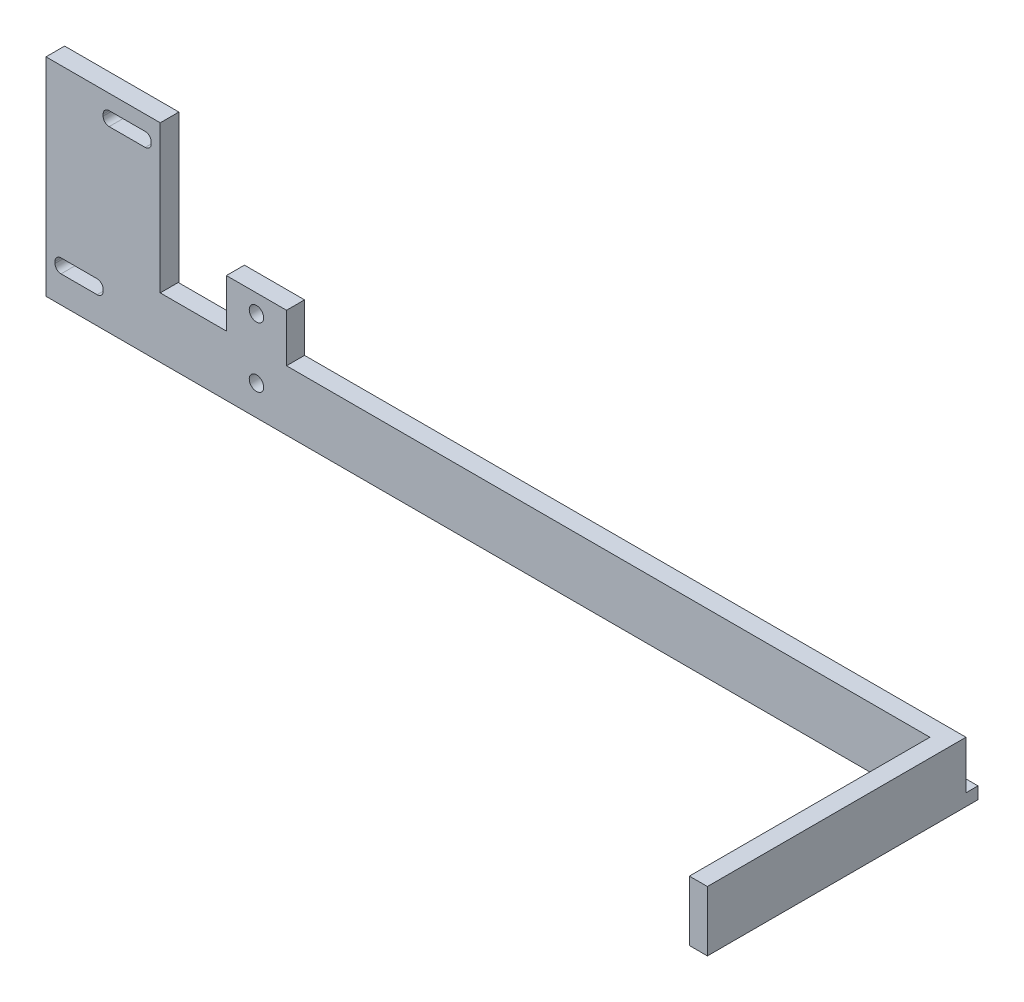
ISO-10303-21;
HEADER;
FILE_DESCRIPTION(('STEP AP214'),'2;1');
FILE_NAME('part.step','',(''),(''),'','','');
FILE_SCHEMA(('AUTOMOTIVE_DESIGN { 1 0 10303 214 1 1 1 1 }'));
ENDSEC;
DATA;
#1=APPLICATION_CONTEXT('core data for automotive mechanical design processes');
#2=APPLICATION_PROTOCOL_DEFINITION('international standard','automotive_design',2000,#1);
#3=PRODUCT_CONTEXT('',#1,'mechanical');
#4=PRODUCT('Part','Part','',(#3));
#5=PRODUCT_RELATED_PRODUCT_CATEGORY('part','',(#4));
#6=PRODUCT_DEFINITION_FORMATION('','',#4);
#7=PRODUCT_DEFINITION_CONTEXT('part definition',#1,'design');
#8=PRODUCT_DEFINITION('design','',#6,#7);
#9=PRODUCT_DEFINITION_SHAPE('','',#8);
#10=(LENGTH_UNIT() NAMED_UNIT(*) SI_UNIT(.MILLI.,.METRE.));
#11=(NAMED_UNIT(*) PLANE_ANGLE_UNIT() SI_UNIT($,.RADIAN.));
#12=(NAMED_UNIT(*) SI_UNIT($,.STERADIAN.) SOLID_ANGLE_UNIT());
#13=UNCERTAINTY_MEASURE_WITH_UNIT(LENGTH_MEASURE(1.E-05),#10,'distance_accuracy_value','');
#14=(GEOMETRIC_REPRESENTATION_CONTEXT(3) GLOBAL_UNCERTAINTY_ASSIGNED_CONTEXT((#13)) GLOBAL_UNIT_ASSIGNED_CONTEXT((#10,
#11,#12)) REPRESENTATION_CONTEXT('',''));
#15=CARTESIAN_POINT('',(0.,0.,0.));
#16=DIRECTION('',(0.,0.,1.));
#17=DIRECTION('',(1.,0.,0.));
#18=AXIS2_PLACEMENT_3D('',#15,#16,#17);
#19=CARTESIAN_POINT('',(-87.,10.,-21.5));
#20=DIRECTION('',(0.,0.,1.));
#21=DIRECTION('',(1.,0.,0.));
#22=AXIS2_PLACEMENT_3D('',#19,#20,#21);
#23=PLANE('',#22);
#24=CARTESIAN_POINT('',(-52.,15.,-21.5));
#25=DIRECTION('',(0.,0.,-1.));
#26=DIRECTION('',(-1.,0.,0.));
#27=AXIS2_PLACEMENT_3D('',#24,#25,#26);
#28=CIRCLE('',#27,1.2);
#29=CARTESIAN_POINT('',(-53.2,15.,-21.5));
#30=VERTEX_POINT('',#29);
#31=EDGE_CURVE('E299',#30,#30,#28,.T.);
#32=ORIENTED_EDGE('',*,*,#31,.F.);
#33=EDGE_LOOP('',(#32));
#34=FACE_BOUND('',#33,.T.);
#35=CARTESIAN_POINT('',(-52.,5.,-21.5));
#36=DIRECTION('',(0.,0.,-1.));
#37=DIRECTION('',(-1.,0.,0.));
#38=AXIS2_PLACEMENT_3D('',#35,#36,#37);
#39=CIRCLE('',#38,1.2);
#40=CARTESIAN_POINT('',(-53.2,5.,-21.5));
#41=VERTEX_POINT('',#40);
#42=EDGE_CURVE('E295',#41,#41,#39,.T.);
#43=ORIENTED_EDGE('',*,*,#42,.F.);
#44=EDGE_LOOP('',(#43));
#45=FACE_BOUND('',#44,.T.);
#46=DIRECTION('',(1.,0.,0.));
#47=VECTOR('',#46,1.);
#48=CARTESIAN_POINT('',(63.,2.,-21.5));
#49=LINE('',#48,#47);
#50=CARTESIAN_POINT('',(-68.,2.,-21.5));
#51=VERTEX_POINT('',#50);
#52=CARTESIAN_POINT('',(63.,2.,-21.5));
#53=VERTEX_POINT('',#52);
#54=EDGE_CURVE('E277',#51,#53,#49,.T.);
#55=ORIENTED_EDGE('',*,*,#54,.F.);
#56=DIRECTION('',(0.,1.,0.));
#57=VECTOR('',#56,1.);
#58=CARTESIAN_POINT('',(-68.,10.,-21.5));
#59=LINE('',#58,#57);
#60=CARTESIAN_POINT('',(-68.,10.,-21.5));
#61=VERTEX_POINT('',#60);
#62=EDGE_CURVE('E270',#51,#61,#59,.T.);
#63=ORIENTED_EDGE('',*,*,#62,.T.);
#64=DIRECTION('',(-1.,0.,0.));
#65=VECTOR('',#64,1.);
#66=CARTESIAN_POINT('',(-87.,10.,-21.5));
#67=LINE('',#66,#65);
#68=CARTESIAN_POINT('',(-57.,10.,-21.5));
#69=VERTEX_POINT('',#68);
#70=EDGE_CURVE('E333',#69,#61,#67,.T.);
#71=ORIENTED_EDGE('',*,*,#70,.F.);
#72=DIRECTION('',(0.,1.,0.));
#73=VECTOR('',#72,1.);
#74=CARTESIAN_POINT('',(-57.,0.,-21.5));
#75=LINE('',#74,#73);
#76=CARTESIAN_POINT('',(-57.,18.,-21.5));
#77=VERTEX_POINT('',#76);
#78=EDGE_CURVE('E316',#69,#77,#75,.T.);
#79=ORIENTED_EDGE('',*,*,#78,.T.);
#80=DIRECTION('',(1.,0.,0.));
#81=VECTOR('',#80,1.);
#82=CARTESIAN_POINT('',(-47.,18.,-21.5));
#83=LINE('',#82,#81);
#84=CARTESIAN_POINT('',(-47.,18.,-21.5));
#85=VERTEX_POINT('',#84);
#86=EDGE_CURVE('E307',#77,#85,#83,.T.);
#87=ORIENTED_EDGE('',*,*,#86,.T.);
#88=DIRECTION('',(0.,-1.,0.));
#89=VECTOR('',#88,1.);
#90=CARTESIAN_POINT('',(-47.,0.,-21.5));
#91=LINE('',#90,#89);
#92=CARTESIAN_POINT('',(-47.,10.,-21.5));
#93=VERTEX_POINT('',#92);
#94=EDGE_CURVE('E313',#85,#93,#91,.T.);
#95=ORIENTED_EDGE('',*,*,#94,.T.);
#96=CARTESIAN_POINT('',(63.,10.,-21.5));
#97=VERTEX_POINT('',#96);
#98=EDGE_CURVE('E335',#97,#93,#67,.T.);
#99=ORIENTED_EDGE('',*,*,#98,.F.);
#100=DIRECTION('',(0.,-1.,0.));
#101=VECTOR('',#100,1.);
#102=CARTESIAN_POINT('',(63.,10.,-21.5));
#103=LINE('',#102,#101);
#104=EDGE_CURVE('E364',#97,#53,#103,.T.);
#105=ORIENTED_EDGE('',*,*,#104,.T.);
#106=EDGE_LOOP('',(#55,#63,#71,#79,#87,#95,#99,#105));
#107=FACE_BOUND('',#106,.T.);
#108=ADVANCED_FACE('F35',(#34,#45,#107),#23,.F.);
#109=CARTESIAN_POINT('',(0.,10.,0.));
#110=DIRECTION('',(0.,-1.,0.));
#111=DIRECTION('',(0.,0.,-1.));
#112=AXIS2_PLACEMENT_3D('',#109,#110,#111);
#113=PLANE('',#112);
#114=ORIENTED_EDGE('',*,*,#98,.T.);
#115=DIRECTION('',(0.,0.,1.));
#116=VECTOR('',#115,1.);
#117=CARTESIAN_POINT('',(-47.,10.,0.));
#118=LINE('',#117,#116);
#119=CARTESIAN_POINT('',(-47.,10.,-18.5));
#120=VERTEX_POINT('',#119);
#121=EDGE_CURVE('E327',#93,#120,#118,.T.);
#122=ORIENTED_EDGE('',*,*,#121,.T.);
#123=DIRECTION('',(1.,0.,0.));
#124=VECTOR('',#123,1.);
#125=CARTESIAN_POINT('',(-87.,10.,-18.5));
#126=LINE('',#125,#124);
#127=CARTESIAN_POINT('',(60.,10.,-18.5));
#128=VERTEX_POINT('',#127);
#129=EDGE_CURVE('E337',#120,#128,#126,.T.);
#130=ORIENTED_EDGE('',*,*,#129,.T.);
#131=DIRECTION('',(0.,0.,1.));
#132=VECTOR('',#131,1.);
#133=CARTESIAN_POINT('',(60.,10.,21.5));
#134=LINE('',#133,#132);
#135=CARTESIAN_POINT('',(60.,10.,21.5));
#136=VERTEX_POINT('',#135);
#137=EDGE_CURVE('E340',#128,#136,#134,.T.);
#138=ORIENTED_EDGE('',*,*,#137,.T.);
#139=DIRECTION('',(1.,0.,0.));
#140=VECTOR('',#139,1.);
#141=CARTESIAN_POINT('',(63.,10.,21.5));
#142=LINE('',#141,#140);
#143=CARTESIAN_POINT('',(63.,10.,21.5));
#144=VERTEX_POINT('',#143);
#145=EDGE_CURVE('E342',#136,#144,#142,.T.);
#146=ORIENTED_EDGE('',*,*,#145,.T.);
#147=DIRECTION('',(0.,0.,-1.));
#148=VECTOR('',#147,1.);
#149=CARTESIAN_POINT('',(63.,10.,-21.5));
#150=LINE('',#149,#148);
#151=EDGE_CURVE('E330',#144,#97,#150,.T.);
#152=ORIENTED_EDGE('',*,*,#151,.T.);
#153=EDGE_LOOP('',(#114,#122,#130,#138,#146,#152));
#154=FACE_BOUND('',#153,.T.);
#155=ADVANCED_FACE('F485',(#154),#113,.F.);
#156=CARTESIAN_POINT('',(63.,10.,-21.5));
#157=DIRECTION('',(-1.,0.,0.));
#158=DIRECTION('',(0.,0.,1.));
#159=AXIS2_PLACEMENT_3D('',#156,#157,#158);
#160=PLANE('',#159);
#161=DIRECTION('',(0.,0.,-1.));
#162=VECTOR('',#161,1.);
#163=CARTESIAN_POINT('',(63.,0.,-21.5));
#164=LINE('',#163,#162);
#165=CARTESIAN_POINT('',(63.,0.,21.5));
#166=VERTEX_POINT('',#165);
#167=CARTESIAN_POINT('',(63.,0.,-23.5));
#168=VERTEX_POINT('',#167);
#169=EDGE_CURVE('E329',#166,#168,#164,.T.);
#170=ORIENTED_EDGE('',*,*,#169,.T.);
#171=DIRECTION('',(0.,-1.,0.));
#172=VECTOR('',#171,1.);
#173=CARTESIAN_POINT('',(63.,0.,-23.5));
#174=LINE('',#173,#172);
#175=CARTESIAN_POINT('',(63.,2.,-23.5));
#176=VERTEX_POINT('',#175);
#177=EDGE_CURVE('E278',#176,#168,#174,.T.);
#178=ORIENTED_EDGE('',*,*,#177,.F.);
#179=DIRECTION('',(0.,0.,1.));
#180=VECTOR('',#179,1.);
#181=CARTESIAN_POINT('',(63.,2.,-23.5));
#182=LINE('',#181,#180);
#183=EDGE_CURVE('E288',#176,#53,#182,.T.);
#184=ORIENTED_EDGE('',*,*,#183,.T.);
#185=ORIENTED_EDGE('',*,*,#104,.F.);
#186=ORIENTED_EDGE('',*,*,#151,.F.);
#187=DIRECTION('',(0.,-1.,0.));
#188=VECTOR('',#187,1.);
#189=CARTESIAN_POINT('',(63.,10.,21.5));
#190=LINE('',#189,#188);
#191=EDGE_CURVE('E344',#144,#166,#190,.T.);
#192=ORIENTED_EDGE('',*,*,#191,.T.);
#193=EDGE_LOOP('',(#170,#178,#184,#185,#186,#192));
#194=FACE_BOUND('',#193,.T.);
#195=ADVANCED_FACE('F491',(#194),#160,.F.);
#196=CARTESIAN_POINT('',(-87.,10.,-21.5));
#197=DIRECTION('',(1.,0.,0.));
#198=DIRECTION('',(0.,0.,-1.));
#199=AXIS2_PLACEMENT_3D('',#196,#197,#198);
#200=PLANE('',#199);
#201=DIRECTION('',(0.,0.,1.));
#202=VECTOR('',#201,1.);
#203=CARTESIAN_POINT('',(-87.,0.,-21.5));
#204=LINE('',#203,#202);
#205=CARTESIAN_POINT('',(-87.,0.,-23.5));
#206=VERTEX_POINT('',#205);
#207=CARTESIAN_POINT('',(-87.,0.,-18.5));
#208=VERTEX_POINT('',#207);
#209=EDGE_CURVE('E346',#206,#208,#204,.T.);
#210=ORIENTED_EDGE('',*,*,#209,.T.);
#211=DIRECTION('',(0.,-1.,0.));
#212=VECTOR('',#211,1.);
#213=CARTESIAN_POINT('',(-87.,10.,-18.5));
#214=LINE('',#213,#212);
#215=CARTESIAN_POINT('',(-87.,34.5,-18.5));
#216=VERTEX_POINT('',#215);
#217=EDGE_CURVE('E361',#216,#208,#214,.T.);
#218=ORIENTED_EDGE('',*,*,#217,.F.);
#219=DIRECTION('',(0.,0.,1.));
#220=VECTOR('',#219,1.);
#221=CARTESIAN_POINT('',(-87.,34.5,-21.6));
#222=LINE('',#221,#220);
#223=CARTESIAN_POINT('',(-87.,34.5,-21.6));
#224=VERTEX_POINT('',#223);
#225=EDGE_CURVE('E257',#224,#216,#222,.T.);
#226=ORIENTED_EDGE('',*,*,#225,.F.);
#227=DIRECTION('',(0.,-1.,0.));
#228=VECTOR('',#227,1.);
#229=CARTESIAN_POINT('',(-87.,0.,-21.6));
#230=LINE('',#229,#228);
#231=CARTESIAN_POINT('',(-87.,2.,-21.6));
#232=VERTEX_POINT('',#231);
#233=EDGE_CURVE('E258',#224,#232,#230,.T.);
#234=ORIENTED_EDGE('',*,*,#233,.T.);
#235=DIRECTION('',(0.,0.,1.));
#236=VECTOR('',#235,1.);
#237=CARTESIAN_POINT('',(-87.,2.,-23.5));
#238=LINE('',#237,#236);
#239=CARTESIAN_POINT('',(-87.,2.,-23.5));
#240=VERTEX_POINT('',#239);
#241=EDGE_CURVE('E292',#240,#232,#238,.T.);
#242=ORIENTED_EDGE('',*,*,#241,.F.);
#243=DIRECTION('',(0.,1.,0.));
#244=VECTOR('',#243,1.);
#245=CARTESIAN_POINT('',(-87.,0.,-23.5));
#246=LINE('',#245,#244);
#247=EDGE_CURVE('E284',#206,#240,#246,.T.);
#248=ORIENTED_EDGE('',*,*,#247,.F.);
#249=EDGE_LOOP('',(#210,#218,#226,#234,#242,#248));
#250=FACE_BOUND('',#249,.T.);
#251=ADVANCED_FACE('F499',(#250),#200,.F.);
#252=CARTESIAN_POINT('',(-60.,10.,-18.5));
#253=DIRECTION('',(0.,0.,-1.));
#254=DIRECTION('',(-1.,0.,0.));
#255=AXIS2_PLACEMENT_3D('',#252,#253,#254);
#256=PLANE('',#255);
#257=DIRECTION('',(1.,0.,0.));
#258=VECTOR('',#257,1.);
#259=CARTESIAN_POINT('',(-85.5,4.48979625729788,-18.5));
#260=LINE('',#259,#258);
#261=CARTESIAN_POINT('',(-84.5,4.48979625729788,-18.5));
#262=VERTEX_POINT('',#261);
#263=CARTESIAN_POINT('',(-78.5,4.48979625729788,-18.5));
#264=VERTEX_POINT('',#263);
#265=EDGE_CURVE('E534',#262,#264,#260,.T.);
#266=ORIENTED_EDGE('',*,*,#265,.F.);
#267=CARTESIAN_POINT('',(-84.5,5.48979625729788,-18.5));
#268=DIRECTION('',(0.,0.,-1.));
#269=DIRECTION('',(-1.,0.,0.));
#270=AXIS2_PLACEMENT_3D('',#267,#268,#269);
#271=CIRCLE('',#270,1.);
#272=CARTESIAN_POINT('',(-85.5,5.48979625729788,-18.5));
#273=VERTEX_POINT('',#272);
#274=EDGE_CURVE('E453',#262,#273,#271,.T.);
#275=ORIENTED_EDGE('',*,*,#274,.T.);
#276=DIRECTION('',(0.,-1.,0.));
#277=VECTOR('',#276,1.);
#278=CARTESIAN_POINT('',(-85.5,4.48979625729788,-18.5));
#279=LINE('',#278,#277);
#280=CARTESIAN_POINT('',(-85.5,5.78979625729788,-18.5));
#281=VERTEX_POINT('',#280);
#282=EDGE_CURVE('E545',#281,#273,#279,.T.);
#283=ORIENTED_EDGE('',*,*,#282,.F.);
#284=CARTESIAN_POINT('',(-84.5,5.78979625729788,-18.5));
#285=DIRECTION('',(0.,0.,-1.));
#286=DIRECTION('',(-1.,0.,0.));
#287=AXIS2_PLACEMENT_3D('',#284,#285,#286);
#288=CIRCLE('',#287,1.);
#289=CARTESIAN_POINT('',(-84.5,6.78979625729788,-18.5));
#290=VERTEX_POINT('',#289);
#291=EDGE_CURVE('E43',#281,#290,#288,.T.);
#292=ORIENTED_EDGE('',*,*,#291,.T.);
#293=DIRECTION('',(-1.,0.,0.));
#294=VECTOR('',#293,1.);
#295=CARTESIAN_POINT('',(-85.5,6.78979625729788,-18.5));
#296=LINE('',#295,#294);
#297=CARTESIAN_POINT('',(-78.5,6.78979625729788,-18.5));
#298=VERTEX_POINT('',#297);
#299=EDGE_CURVE('E541',#298,#290,#296,.T.);
#300=ORIENTED_EDGE('',*,*,#299,.F.);
#301=CARTESIAN_POINT('',(-78.5,5.78979625729788,-18.5));
#302=DIRECTION('',(0.,0.,-1.));
#303=DIRECTION('',(-1.,0.,0.));
#304=AXIS2_PLACEMENT_3D('',#301,#302,#303);
#305=CIRCLE('',#304,1.);
#306=CARTESIAN_POINT('',(-77.5,5.78979625729788,-18.5));
#307=VERTEX_POINT('',#306);
#308=EDGE_CURVE('E57',#298,#307,#305,.T.);
#309=ORIENTED_EDGE('',*,*,#308,.T.);
#310=DIRECTION('',(0.,1.,0.));
#311=VECTOR('',#310,1.);
#312=CARTESIAN_POINT('',(-77.5,4.48979625729788,-18.5));
#313=LINE('',#312,#311);
#314=CARTESIAN_POINT('',(-77.5,5.48979625729788,-18.5));
#315=VERTEX_POINT('',#314);
#316=EDGE_CURVE('E540',#315,#307,#313,.T.);
#317=ORIENTED_EDGE('',*,*,#316,.F.);
#318=CARTESIAN_POINT('',(-78.5,5.48979625729788,-18.5));
#319=DIRECTION('',(0.,0.,-1.));
#320=DIRECTION('',(-1.,0.,0.));
#321=AXIS2_PLACEMENT_3D('',#318,#319,#320);
#322=CIRCLE('',#321,1.);
#323=EDGE_CURVE('E457',#315,#264,#322,.T.);
#324=ORIENTED_EDGE('',*,*,#323,.T.);
#325=EDGE_LOOP('',(#266,#275,#283,#292,#300,#309,#317,#324));
#326=FACE_BOUND('',#325,.T.);
#327=DIRECTION('',(-1.,0.,0.));
#328=VECTOR('',#327,1.);
#329=CARTESIAN_POINT('',(-69.5,32.0000074685371,-18.5));
#330=LINE('',#329,#328);
#331=CARTESIAN_POINT('',(-70.5,32.0000074685371,-18.5));
#332=VERTEX_POINT('',#331);
#333=CARTESIAN_POINT('',(-76.5,32.0000074685371,-18.5));
#334=VERTEX_POINT('',#333);
#335=EDGE_CURVE('E551',#332,#334,#330,.T.);
#336=ORIENTED_EDGE('',*,*,#335,.F.);
#337=CARTESIAN_POINT('',(-70.5,31.0000074685371,-18.5));
#338=DIRECTION('',(0.,0.,-1.));
#339=DIRECTION('',(-1.,0.,0.));
#340=AXIS2_PLACEMENT_3D('',#337,#338,#339);
#341=CIRCLE('',#340,1.);
#342=CARTESIAN_POINT('',(-69.5,31.0000074685371,-18.5));
#343=VERTEX_POINT('',#342);
#344=EDGE_CURVE('E437',#332,#343,#341,.T.);
#345=ORIENTED_EDGE('',*,*,#344,.T.);
#346=DIRECTION('',(0.,1.,0.));
#347=VECTOR('',#346,1.);
#348=CARTESIAN_POINT('',(-69.5,32.0000074685371,-18.5));
#349=LINE('',#348,#347);
#350=CARTESIAN_POINT('',(-69.5,30.7000074685371,-18.5));
#351=VERTEX_POINT('',#350);
#352=EDGE_CURVE('E543',#351,#343,#349,.T.);
#353=ORIENTED_EDGE('',*,*,#352,.F.);
#354=CARTESIAN_POINT('',(-70.5,30.7000074685371,-18.5));
#355=DIRECTION('',(0.,0.,-1.));
#356=DIRECTION('',(-1.,0.,0.));
#357=AXIS2_PLACEMENT_3D('',#354,#355,#356);
#358=CIRCLE('',#357,1.);
#359=CARTESIAN_POINT('',(-70.5,29.7000074685371,-18.5));
#360=VERTEX_POINT('',#359);
#361=EDGE_CURVE('E441',#351,#360,#358,.T.);
#362=ORIENTED_EDGE('',*,*,#361,.T.);
#363=DIRECTION('',(1.,0.,0.));
#364=VECTOR('',#363,1.);
#365=CARTESIAN_POINT('',(-69.5,29.7000074685371,-18.5));
#366=LINE('',#365,#364);
#367=CARTESIAN_POINT('',(-76.5,29.7000074685371,-18.5));
#368=VERTEX_POINT('',#367);
#369=EDGE_CURVE('E268',#368,#360,#366,.T.);
#370=ORIENTED_EDGE('',*,*,#369,.F.);
#371=CARTESIAN_POINT('',(-76.5,30.7000074685371,-18.5));
#372=DIRECTION('',(0.,0.,-1.));
#373=DIRECTION('',(-1.,0.,0.));
#374=AXIS2_PLACEMENT_3D('',#371,#372,#373);
#375=CIRCLE('',#374,1.);
#376=CARTESIAN_POINT('',(-77.5,30.7000074685371,-18.5));
#377=VERTEX_POINT('',#376);
#378=EDGE_CURVE('E449',#368,#377,#375,.T.);
#379=ORIENTED_EDGE('',*,*,#378,.T.);
#380=DIRECTION('',(0.,-1.,0.));
#381=VECTOR('',#380,1.);
#382=CARTESIAN_POINT('',(-77.5,32.0000074685371,-18.5));
#383=LINE('',#382,#381);
#384=CARTESIAN_POINT('',(-77.5,31.0000074685371,-18.5));
#385=VERTEX_POINT('',#384);
#386=EDGE_CURVE('E554',#385,#377,#383,.T.);
#387=ORIENTED_EDGE('',*,*,#386,.F.);
#388=CARTESIAN_POINT('',(-76.5,31.0000074685371,-18.5));
#389=DIRECTION('',(0.,0.,-1.));
#390=DIRECTION('',(-1.,0.,0.));
#391=AXIS2_PLACEMENT_3D('',#388,#389,#390);
#392=CIRCLE('',#391,1.);
#393=EDGE_CURVE('E445',#385,#334,#392,.T.);
#394=ORIENTED_EDGE('',*,*,#393,.T.);
#395=EDGE_LOOP('',(#336,#345,#353,#362,#370,#379,#387,#394));
#396=FACE_BOUND('',#395,.T.);
#397=CARTESIAN_POINT('',(-52.,5.,-18.5));
#398=DIRECTION('',(0.,0.,-1.));
#399=DIRECTION('',(-1.,0.,0.));
#400=AXIS2_PLACEMENT_3D('',#397,#398,#399);
#401=CIRCLE('',#400,1.2);
#402=CARTESIAN_POINT('',(-53.2,5.,-18.5));
#403=VERTEX_POINT('',#402);
#404=EDGE_CURVE('E298',#403,#403,#401,.T.);
#405=ORIENTED_EDGE('',*,*,#404,.T.);
#406=EDGE_LOOP('',(#405));
#407=FACE_BOUND('',#406,.T.);
#408=CARTESIAN_POINT('',(-52.,15.,-18.5));
#409=DIRECTION('',(0.,0.,-1.));
#410=DIRECTION('',(-1.,0.,0.));
#411=AXIS2_PLACEMENT_3D('',#408,#409,#410);
#412=CIRCLE('',#411,1.2);
#413=CARTESIAN_POINT('',(-53.2,15.,-18.5));
#414=VERTEX_POINT('',#413);
#415=EDGE_CURVE('E302',#414,#414,#412,.T.);
#416=ORIENTED_EDGE('',*,*,#415,.T.);
#417=EDGE_LOOP('',(#416));
#418=FACE_BOUND('',#417,.T.);
#419=CARTESIAN_POINT('',(-68.,10.,-18.5));
#420=VERTEX_POINT('',#419);
#421=CARTESIAN_POINT('',(-57.,10.,-18.5));
#422=VERTEX_POINT('',#421);
#423=EDGE_CURVE('E338',#420,#422,#126,.T.);
#424=ORIENTED_EDGE('',*,*,#423,.F.);
#425=DIRECTION('',(0.,1.,0.));
#426=VECTOR('',#425,1.);
#427=CARTESIAN_POINT('',(-68.,34.5,-18.5));
#428=LINE('',#427,#426);
#429=CARTESIAN_POINT('',(-68.,34.5,-18.5));
#430=VERTEX_POINT('',#429);
#431=EDGE_CURVE('E266',#420,#430,#428,.T.);
#432=ORIENTED_EDGE('',*,*,#431,.T.);
#433=DIRECTION('',(-1.,0.,0.));
#434=VECTOR('',#433,1.);
#435=CARTESIAN_POINT('',(-87.,34.5,-18.5));
#436=LINE('',#435,#434);
#437=EDGE_CURVE('E249',#430,#216,#436,.T.);
#438=ORIENTED_EDGE('',*,*,#437,.T.);
#439=ORIENTED_EDGE('',*,*,#217,.T.);
#440=DIRECTION('',(1.,0.,0.));
#441=VECTOR('',#440,1.);
#442=CARTESIAN_POINT('',(-60.,0.,-18.5));
#443=LINE('',#442,#441);
#444=CARTESIAN_POINT('',(60.,0.,-18.5));
#445=VERTEX_POINT('',#444);
#446=EDGE_CURVE('E348',#208,#445,#443,.T.);
#447=ORIENTED_EDGE('',*,*,#446,.T.);
#448=DIRECTION('',(0.,-1.,0.));
#449=VECTOR('',#448,1.);
#450=CARTESIAN_POINT('',(60.,10.,-18.5));
#451=LINE('',#450,#449);
#452=EDGE_CURVE('E358',#128,#445,#451,.T.);
#453=ORIENTED_EDGE('',*,*,#452,.F.);
#454=ORIENTED_EDGE('',*,*,#129,.F.);
#455=DIRECTION('',(0.,-1.,0.));
#456=VECTOR('',#455,1.);
#457=CARTESIAN_POINT('',(-47.,0.,-18.5));
#458=LINE('',#457,#456);
#459=CARTESIAN_POINT('',(-47.,18.,-18.5));
#460=VERTEX_POINT('',#459);
#461=EDGE_CURVE('E303',#460,#120,#458,.T.);
#462=ORIENTED_EDGE('',*,*,#461,.F.);
#463=DIRECTION('',(1.,0.,0.));
#464=VECTOR('',#463,1.);
#465=CARTESIAN_POINT('',(-47.,18.,-18.5));
#466=LINE('',#465,#464);
#467=CARTESIAN_POINT('',(-57.,18.,-18.5));
#468=VERTEX_POINT('',#467);
#469=EDGE_CURVE('E309',#468,#460,#466,.T.);
#470=ORIENTED_EDGE('',*,*,#469,.F.);
#471=DIRECTION('',(0.,1.,0.));
#472=VECTOR('',#471,1.);
#473=CARTESIAN_POINT('',(-57.,0.,-18.5));
#474=LINE('',#473,#472);
#475=EDGE_CURVE('E306',#422,#468,#474,.T.);
#476=ORIENTED_EDGE('',*,*,#475,.F.);
#477=EDGE_LOOP('',(#424,#432,#438,#439,#447,#453,#454,#462,#470,#476));
#478=FACE_BOUND('',#477,.T.);
#479=ADVANCED_FACE('F586',(#326,#396,#407,#418,#478),#256,.F.);
#480=CARTESIAN_POINT('',(60.,10.,21.5));
#481=DIRECTION('',(1.,0.,0.));
#482=DIRECTION('',(0.,0.,-1.));
#483=AXIS2_PLACEMENT_3D('',#480,#481,#482);
#484=PLANE('',#483);
#485=DIRECTION('',(0.,0.,1.));
#486=VECTOR('',#485,1.);
#487=CARTESIAN_POINT('',(60.,0.,21.5));
#488=LINE('',#487,#486);
#489=CARTESIAN_POINT('',(60.,0.,21.5));
#490=VERTEX_POINT('',#489);
#491=EDGE_CURVE('E350',#445,#490,#488,.T.);
#492=ORIENTED_EDGE('',*,*,#491,.T.);
#493=DIRECTION('',(0.,-1.,0.));
#494=VECTOR('',#493,1.);
#495=CARTESIAN_POINT('',(60.,10.,21.5));
#496=LINE('',#495,#494);
#497=EDGE_CURVE('E355',#136,#490,#496,.T.);
#498=ORIENTED_EDGE('',*,*,#497,.F.);
#499=ORIENTED_EDGE('',*,*,#137,.F.);
#500=ORIENTED_EDGE('',*,*,#452,.T.);
#501=EDGE_LOOP('',(#492,#498,#499,#500));
#502=FACE_BOUND('',#501,.T.);
#503=ADVANCED_FACE('F589',(#502),#484,.F.);
#504=CARTESIAN_POINT('',(63.,10.,21.5));
#505=DIRECTION('',(0.,0.,-1.));
#506=DIRECTION('',(-1.,0.,0.));
#507=AXIS2_PLACEMENT_3D('',#504,#505,#506);
#508=PLANE('',#507);
#509=DIRECTION('',(1.,0.,0.));
#510=VECTOR('',#509,1.);
#511=CARTESIAN_POINT('',(63.,0.,21.5));
#512=LINE('',#511,#510);
#513=EDGE_CURVE('E334',#490,#166,#512,.T.);
#514=ORIENTED_EDGE('',*,*,#513,.T.);
#515=ORIENTED_EDGE('',*,*,#191,.F.);
#516=ORIENTED_EDGE('',*,*,#145,.F.);
#517=ORIENTED_EDGE('',*,*,#497,.T.);
#518=EDGE_LOOP('',(#514,#515,#516,#517));
#519=FACE_BOUND('',#518,.T.);
#520=ADVANCED_FACE('F628',(#519),#508,.F.);
#521=ORIENTED_EDGE('',*,*,#70,.T.);
#522=DIRECTION('',(0.,0.,1.));
#523=VECTOR('',#522,1.);
#524=CARTESIAN_POINT('',(-68.,10.,0.));
#525=LINE('',#524,#523);
#526=EDGE_CURVE('E274',#61,#420,#525,.T.);
#527=ORIENTED_EDGE('',*,*,#526,.T.);
#528=ORIENTED_EDGE('',*,*,#423,.T.);
#529=DIRECTION('',(0.,0.,-1.));
#530=VECTOR('',#529,1.);
#531=CARTESIAN_POINT('',(-57.,10.,0.));
#532=LINE('',#531,#530);
#533=EDGE_CURVE('E322',#422,#69,#532,.T.);
#534=ORIENTED_EDGE('',*,*,#533,.T.);
#535=EDGE_LOOP('',(#521,#527,#528,#534));
#536=FACE_BOUND('',#535,.T.);
#537=ADVANCED_FACE('F494',(#536),#113,.F.);
#538=CARTESIAN_POINT('',(0.,0.,0.));
#539=DIRECTION('',(0.,-1.,0.));
#540=DIRECTION('',(0.,0.,-1.));
#541=AXIS2_PLACEMENT_3D('',#538,#539,#540);
#542=PLANE('',#541);
#543=ORIENTED_EDGE('',*,*,#491,.F.);
#544=ORIENTED_EDGE('',*,*,#446,.F.);
#545=ORIENTED_EDGE('',*,*,#209,.F.);
#546=DIRECTION('',(-1.,0.,0.));
#547=VECTOR('',#546,1.);
#548=CARTESIAN_POINT('',(63.,0.,-23.5));
#549=LINE('',#548,#547);
#550=EDGE_CURVE('E281',#168,#206,#549,.T.);
#551=ORIENTED_EDGE('',*,*,#550,.F.);
#552=ORIENTED_EDGE('',*,*,#169,.F.);
#553=ORIENTED_EDGE('',*,*,#513,.F.);
#554=EDGE_LOOP('',(#543,#544,#545,#551,#552,#553));
#555=FACE_BOUND('',#554,.T.);
#556=ADVANCED_FACE('F623',(#555),#542,.T.);
#557=CARTESIAN_POINT('',(-47.,0.,-18.5));
#558=DIRECTION('',(1.,0.,0.));
#559=DIRECTION('',(0.,0.,-1.));
#560=AXIS2_PLACEMENT_3D('',#557,#558,#559);
#561=PLANE('',#560);
#562=ORIENTED_EDGE('',*,*,#121,.F.);
#563=ORIENTED_EDGE('',*,*,#94,.F.);
#564=DIRECTION('',(0.,0.,-1.));
#565=VECTOR('',#564,1.);
#566=CARTESIAN_POINT('',(-47.,18.,-18.5));
#567=LINE('',#566,#565);
#568=EDGE_CURVE('E320',#460,#85,#567,.T.);
#569=ORIENTED_EDGE('',*,*,#568,.F.);
#570=ORIENTED_EDGE('',*,*,#461,.T.);
#571=EDGE_LOOP('',(#562,#563,#569,#570));
#572=FACE_BOUND('',#571,.T.);
#573=ADVANCED_FACE('F636',(#572),#561,.T.);
#574=CARTESIAN_POINT('',(-57.,0.,-18.5));
#575=DIRECTION('',(-1.,0.,0.));
#576=DIRECTION('',(0.,0.,1.));
#577=AXIS2_PLACEMENT_3D('',#574,#575,#576);
#578=PLANE('',#577);
#579=ORIENTED_EDGE('',*,*,#533,.F.);
#580=ORIENTED_EDGE('',*,*,#475,.T.);
#581=DIRECTION('',(0.,0.,-1.));
#582=VECTOR('',#581,1.);
#583=CARTESIAN_POINT('',(-57.,18.,-18.5));
#584=LINE('',#583,#582);
#585=EDGE_CURVE('E312',#468,#77,#584,.T.);
#586=ORIENTED_EDGE('',*,*,#585,.T.);
#587=ORIENTED_EDGE('',*,*,#78,.F.);
#588=EDGE_LOOP('',(#579,#580,#586,#587));
#589=FACE_BOUND('',#588,.T.);
#590=ADVANCED_FACE('F602',(#589),#578,.T.);
#591=CARTESIAN_POINT('',(-47.,18.,-18.5));
#592=DIRECTION('',(0.,1.,0.));
#593=DIRECTION('',(0.,0.,1.));
#594=AXIS2_PLACEMENT_3D('',#591,#592,#593);
#595=PLANE('',#594);
#596=ORIENTED_EDGE('',*,*,#86,.F.);
#597=ORIENTED_EDGE('',*,*,#585,.F.);
#598=ORIENTED_EDGE('',*,*,#469,.T.);
#599=ORIENTED_EDGE('',*,*,#568,.T.);
#600=EDGE_LOOP('',(#596,#597,#598,#599));
#601=FACE_BOUND('',#600,.T.);
#602=ADVANCED_FACE('F639',(#601),#595,.T.);
#603=CARTESIAN_POINT('',(-52.,15.,21.5));
#604=DIRECTION('',(0.,0.,-1.));
#605=DIRECTION('',(-1.,0.,0.));
#606=AXIS2_PLACEMENT_3D('',#603,#604,#605);
#607=CYLINDRICAL_SURFACE('',#606,1.2);
#608=ORIENTED_EDGE('',*,*,#31,.T.);
#609=EDGE_LOOP('',(#608));
#610=FACE_BOUND('',#609,.T.);
#611=ORIENTED_EDGE('',*,*,#415,.F.);
#612=EDGE_LOOP('',(#611));
#613=FACE_BOUND('',#612,.T.);
#614=ADVANCED_FACE('F641',(#610,#613),#607,.F.);
#615=CARTESIAN_POINT('',(-52.,5.,21.5));
#616=DIRECTION('',(0.,0.,-1.));
#617=DIRECTION('',(-1.,0.,0.));
#618=AXIS2_PLACEMENT_3D('',#615,#616,#617);
#619=CYLINDRICAL_SURFACE('',#618,1.2);
#620=ORIENTED_EDGE('',*,*,#42,.T.);
#621=EDGE_LOOP('',(#620));
#622=FACE_BOUND('',#621,.T.);
#623=ORIENTED_EDGE('',*,*,#404,.F.);
#624=EDGE_LOOP('',(#623));
#625=FACE_BOUND('',#624,.T.);
#626=ADVANCED_FACE('F647',(#622,#625),#619,.F.);
#627=CARTESIAN_POINT('',(63.,2.,-23.5));
#628=DIRECTION('',(0.,-1.,0.));
#629=DIRECTION('',(0.,0.,-1.));
#630=AXIS2_PLACEMENT_3D('',#627,#628,#629);
#631=PLANE('',#630);
#632=DIRECTION('',(1.,0.,0.));
#633=VECTOR('',#632,1.);
#634=CARTESIAN_POINT('',(63.,2.,-21.6));
#635=LINE('',#634,#633);
#636=CARTESIAN_POINT('',(-68.,2.,-21.6));
#637=VERTEX_POINT('',#636);
#638=EDGE_CURVE('E367',#232,#637,#635,.T.);
#639=ORIENTED_EDGE('',*,*,#638,.T.);
#640=DIRECTION('',(0.,0.,1.));
#641=VECTOR('',#640,1.);
#642=CARTESIAN_POINT('',(-68.,2.,-23.5));
#643=LINE('',#642,#641);
#644=EDGE_CURVE('E244',#637,#51,#643,.T.);
#645=ORIENTED_EDGE('',*,*,#644,.T.);
#646=ORIENTED_EDGE('',*,*,#54,.T.);
#647=ORIENTED_EDGE('',*,*,#183,.F.);
#648=DIRECTION('',(1.,0.,0.));
#649=VECTOR('',#648,1.);
#650=CARTESIAN_POINT('',(63.,2.,-23.5));
#651=LINE('',#650,#649);
#652=EDGE_CURVE('E286',#240,#176,#651,.T.);
#653=ORIENTED_EDGE('',*,*,#652,.F.);
#654=ORIENTED_EDGE('',*,*,#241,.T.);
#655=EDGE_LOOP('',(#639,#645,#646,#647,#653,#654));
#656=FACE_BOUND('',#655,.T.);
#657=ADVANCED_FACE('F608',(#656),#631,.F.);
#658=CARTESIAN_POINT('',(0.,0.,-23.5));
#659=DIRECTION('',(0.,0.,1.));
#660=DIRECTION('',(1.,0.,0.));
#661=AXIS2_PLACEMENT_3D('',#658,#659,#660);
#662=PLANE('',#661);
#663=ORIENTED_EDGE('',*,*,#177,.T.);
#664=ORIENTED_EDGE('',*,*,#550,.T.);
#665=ORIENTED_EDGE('',*,*,#247,.T.);
#666=ORIENTED_EDGE('',*,*,#652,.T.);
#667=EDGE_LOOP('',(#663,#664,#665,#666));
#668=FACE_BOUND('',#667,.T.);
#669=ADVANCED_FACE('F723',(#668),#662,.F.);
#670=CARTESIAN_POINT('',(-68.,34.5,-21.6));
#671=DIRECTION('',(1.,0.,0.));
#672=DIRECTION('',(0.,0.,-1.));
#673=AXIS2_PLACEMENT_3D('',#670,#671,#672);
#674=PLANE('',#673);
#675=ORIENTED_EDGE('',*,*,#526,.F.);
#676=ORIENTED_EDGE('',*,*,#62,.F.);
#677=ORIENTED_EDGE('',*,*,#644,.F.);
#678=DIRECTION('',(0.,1.,0.));
#679=VECTOR('',#678,1.);
#680=CARTESIAN_POINT('',(-68.,34.5,-21.6));
#681=LINE('',#680,#679);
#682=CARTESIAN_POINT('',(-68.,34.5,-21.6));
#683=VERTEX_POINT('',#682);
#684=EDGE_CURVE('E238',#637,#683,#681,.T.);
#685=ORIENTED_EDGE('',*,*,#684,.T.);
#686=DIRECTION('',(0.,0.,1.));
#687=VECTOR('',#686,1.);
#688=CARTESIAN_POINT('',(-68.,34.5,-21.6));
#689=LINE('',#688,#687);
#690=EDGE_CURVE('E241',#683,#430,#689,.T.);
#691=ORIENTED_EDGE('',*,*,#690,.T.);
#692=ORIENTED_EDGE('',*,*,#431,.F.);
#693=EDGE_LOOP('',(#675,#676,#677,#685,#691,#692));
#694=FACE_BOUND('',#693,.T.);
#695=ADVANCED_FACE('F240',(#694),#674,.T.);
#696=CARTESIAN_POINT('',(0.,0.,-21.6));
#697=DIRECTION('',(0.,0.,-1.));
#698=DIRECTION('',(-1.,0.,0.));
#699=AXIS2_PLACEMENT_3D('',#696,#697,#698);
#700=PLANE('',#699);
#701=DIRECTION('',(0.,1.,0.));
#702=VECTOR('',#701,1.);
#703=CARTESIAN_POINT('',(-85.5,0.,-21.6));
#704=LINE('',#703,#702);
#705=CARTESIAN_POINT('',(-85.5,5.48979625729788,-21.6));
#706=VERTEX_POINT('',#705);
#707=CARTESIAN_POINT('',(-85.5,5.78979625729788,-21.6));
#708=VERTEX_POINT('',#707);
#709=EDGE_CURVE('E395',#706,#708,#704,.T.);
#710=ORIENTED_EDGE('',*,*,#709,.F.);
#711=CARTESIAN_POINT('',(-84.5,5.48979625729788,-21.6));
#712=DIRECTION('',(0.,0.,-1.));
#713=DIRECTION('',(-1.,0.,0.));
#714=AXIS2_PLACEMENT_3D('',#711,#712,#713);
#715=CIRCLE('',#714,1.);
#716=CARTESIAN_POINT('',(-84.5,4.48979625729788,-21.6));
#717=VERTEX_POINT('',#716);
#718=EDGE_CURVE('E455',#706,#717,#715,.F.);
#719=ORIENTED_EDGE('',*,*,#718,.T.);
#720=DIRECTION('',(-1.,0.,0.));
#721=VECTOR('',#720,1.);
#722=CARTESIAN_POINT('',(0.,4.48979625729788,-21.6));
#723=LINE('',#722,#721);
#724=CARTESIAN_POINT('',(-78.5,4.48979625729788,-21.6));
#725=VERTEX_POINT('',#724);
#726=EDGE_CURVE('E386',#725,#717,#723,.T.);
#727=ORIENTED_EDGE('',*,*,#726,.F.);
#728=CARTESIAN_POINT('',(-78.5,5.48979625729788,-21.6));
#729=DIRECTION('',(0.,0.,-1.));
#730=DIRECTION('',(-1.,0.,0.));
#731=AXIS2_PLACEMENT_3D('',#728,#729,#730);
#732=CIRCLE('',#731,1.);
#733=CARTESIAN_POINT('',(-77.5,5.48979625729788,-21.6));
#734=VERTEX_POINT('',#733);
#735=EDGE_CURVE('E459',#725,#734,#732,.F.);
#736=ORIENTED_EDGE('',*,*,#735,.T.);
#737=DIRECTION('',(0.,-1.,0.));
#738=VECTOR('',#737,1.);
#739=CARTESIAN_POINT('',(-77.5,0.,-21.6));
#740=LINE('',#739,#738);
#741=CARTESIAN_POINT('',(-77.5,5.78979625729788,-21.6));
#742=VERTEX_POINT('',#741);
#743=EDGE_CURVE('E389',#742,#734,#740,.T.);
#744=ORIENTED_EDGE('',*,*,#743,.F.);
#745=CARTESIAN_POINT('',(-78.5,5.78979625729788,-21.6));
#746=DIRECTION('',(0.,0.,-1.));
#747=DIRECTION('',(-1.,0.,0.));
#748=AXIS2_PLACEMENT_3D('',#745,#746,#747);
#749=CIRCLE('',#748,1.);
#750=CARTESIAN_POINT('',(-78.5,6.78979625729788,-21.6));
#751=VERTEX_POINT('',#750);
#752=EDGE_CURVE('E462',#742,#751,#749,.F.);
#753=ORIENTED_EDGE('',*,*,#752,.T.);
#754=DIRECTION('',(1.,0.,0.));
#755=VECTOR('',#754,1.);
#756=CARTESIAN_POINT('',(0.,6.78979625729789,-21.6));
#757=LINE('',#756,#755);
#758=CARTESIAN_POINT('',(-84.5,6.78979625729788,-21.6));
#759=VERTEX_POINT('',#758);
#760=EDGE_CURVE('E392',#759,#751,#757,.T.);
#761=ORIENTED_EDGE('',*,*,#760,.F.);
#762=CARTESIAN_POINT('',(-84.5,5.78979625729788,-21.6));
#763=DIRECTION('',(0.,0.,-1.));
#764=DIRECTION('',(-1.,0.,0.));
#765=AXIS2_PLACEMENT_3D('',#762,#763,#764);
#766=CIRCLE('',#765,1.);
#767=EDGE_CURVE('E11',#759,#708,#766,.F.);
#768=ORIENTED_EDGE('',*,*,#767,.T.);
#769=EDGE_LOOP('',(#710,#719,#727,#736,#744,#753,#761,#768));
#770=FACE_BOUND('',#769,.T.);
#771=DIRECTION('',(0.,-1.,0.));
#772=VECTOR('',#771,1.);
#773=CARTESIAN_POINT('',(-69.5,0.,-21.6));
#774=LINE('',#773,#772);
#775=CARTESIAN_POINT('',(-69.5,31.0000074685371,-21.6));
#776=VERTEX_POINT('',#775);
#777=CARTESIAN_POINT('',(-69.5,30.7000074685371,-21.6));
#778=VERTEX_POINT('',#777);
#779=EDGE_CURVE('E383',#776,#778,#774,.T.);
#780=ORIENTED_EDGE('',*,*,#779,.F.);
#781=CARTESIAN_POINT('',(-70.5,31.0000074685371,-21.6));
#782=DIRECTION('',(0.,0.,-1.));
#783=DIRECTION('',(-1.,0.,0.));
#784=AXIS2_PLACEMENT_3D('',#781,#782,#783);
#785=CIRCLE('',#784,1.);
#786=CARTESIAN_POINT('',(-70.5,32.0000074685371,-21.6));
#787=VERTEX_POINT('',#786);
#788=EDGE_CURVE('E439',#776,#787,#785,.F.);
#789=ORIENTED_EDGE('',*,*,#788,.T.);
#790=DIRECTION('',(1.,0.,0.));
#791=VECTOR('',#790,1.);
#792=CARTESIAN_POINT('',(0.,32.0000074685371,-21.6));
#793=LINE('',#792,#791);
#794=CARTESIAN_POINT('',(-76.5,32.0000074685371,-21.6));
#795=VERTEX_POINT('',#794);
#796=EDGE_CURVE('E374',#795,#787,#793,.T.);
#797=ORIENTED_EDGE('',*,*,#796,.F.);
#798=CARTESIAN_POINT('',(-76.5,31.0000074685371,-21.6));
#799=DIRECTION('',(0.,0.,-1.));
#800=DIRECTION('',(-1.,0.,0.));
#801=AXIS2_PLACEMENT_3D('',#798,#799,#800);
#802=CIRCLE('',#801,1.);
#803=CARTESIAN_POINT('',(-77.5,31.0000074685371,-21.6));
#804=VERTEX_POINT('',#803);
#805=EDGE_CURVE('E447',#795,#804,#802,.F.);
#806=ORIENTED_EDGE('',*,*,#805,.T.);
#807=DIRECTION('',(0.,1.,0.));
#808=VECTOR('',#807,1.);
#809=CARTESIAN_POINT('',(-77.5,0.,-21.6));
#810=LINE('',#809,#808);
#811=CARTESIAN_POINT('',(-77.5,30.7000074685371,-21.6));
#812=VERTEX_POINT('',#811);
#813=EDGE_CURVE('E377',#812,#804,#810,.T.);
#814=ORIENTED_EDGE('',*,*,#813,.F.);
#815=CARTESIAN_POINT('',(-76.5,30.7000074685371,-21.6));
#816=DIRECTION('',(0.,0.,-1.));
#817=DIRECTION('',(-1.,0.,0.));
#818=AXIS2_PLACEMENT_3D('',#815,#816,#817);
#819=CIRCLE('',#818,1.);
#820=CARTESIAN_POINT('',(-76.5,29.7000074685371,-21.6));
#821=VERTEX_POINT('',#820);
#822=EDGE_CURVE('E451',#812,#821,#819,.F.);
#823=ORIENTED_EDGE('',*,*,#822,.T.);
#824=DIRECTION('',(-1.,0.,0.));
#825=VECTOR('',#824,1.);
#826=CARTESIAN_POINT('',(0.,29.7000074685371,-21.6));
#827=LINE('',#826,#825);
#828=CARTESIAN_POINT('',(-70.5,29.7000074685371,-21.6));
#829=VERTEX_POINT('',#828);
#830=EDGE_CURVE('E380',#829,#821,#827,.T.);
#831=ORIENTED_EDGE('',*,*,#830,.F.);
#832=CARTESIAN_POINT('',(-70.5,30.7000074685371,-21.6));
#833=DIRECTION('',(0.,0.,-1.));
#834=DIRECTION('',(-1.,0.,0.));
#835=AXIS2_PLACEMENT_3D('',#832,#833,#834);
#836=CIRCLE('',#835,1.);
#837=EDGE_CURVE('E443',#829,#778,#836,.F.);
#838=ORIENTED_EDGE('',*,*,#837,.T.);
#839=EDGE_LOOP('',(#780,#789,#797,#806,#814,#823,#831,#838));
#840=FACE_BOUND('',#839,.T.);
#841=ORIENTED_EDGE('',*,*,#638,.F.);
#842=ORIENTED_EDGE('',*,*,#233,.F.);
#843=DIRECTION('',(-1.,0.,0.));
#844=VECTOR('',#843,1.);
#845=CARTESIAN_POINT('',(-87.,34.5,-21.6));
#846=LINE('',#845,#844);
#847=EDGE_CURVE('E248',#683,#224,#846,.T.);
#848=ORIENTED_EDGE('',*,*,#847,.F.);
#849=ORIENTED_EDGE('',*,*,#684,.F.);
#850=EDGE_LOOP('',(#841,#842,#848,#849));
#851=FACE_BOUND('',#850,.T.);
#852=ADVANCED_FACE('F260',(#770,#840,#851),#700,.T.);
#853=CARTESIAN_POINT('',(-87.,34.5,-21.6));
#854=DIRECTION('',(0.,1.,0.));
#855=DIRECTION('',(0.,0.,1.));
#856=AXIS2_PLACEMENT_3D('',#853,#854,#855);
#857=PLANE('',#856);
#858=ORIENTED_EDGE('',*,*,#437,.F.);
#859=ORIENTED_EDGE('',*,*,#690,.F.);
#860=ORIENTED_EDGE('',*,*,#847,.T.);
#861=ORIENTED_EDGE('',*,*,#225,.T.);
#862=EDGE_LOOP('',(#858,#859,#860,#861));
#863=FACE_BOUND('',#862,.T.);
#864=ADVANCED_FACE('F253',(#863),#857,.T.);
#865=CARTESIAN_POINT('',(-69.5,32.0000074685371,-28.5));
#866=DIRECTION('',(1.,0.,0.));
#867=DIRECTION('',(0.,0.,-1.));
#868=AXIS2_PLACEMENT_3D('',#865,#866,#867);
#869=PLANE('',#868);
#870=ORIENTED_EDGE('',*,*,#352,.T.);
#871=DIRECTION('',(0.,0.,1.));
#872=VECTOR('',#871,1.);
#873=CARTESIAN_POINT('',(-69.5,31.0000074685371,-21.6));
#874=LINE('',#873,#872);
#875=EDGE_CURVE('E406',#343,#776,#874,.F.);
#876=ORIENTED_EDGE('',*,*,#875,.T.);
#877=ORIENTED_EDGE('',*,*,#779,.T.);
#878=DIRECTION('',(0.,0.,1.));
#879=VECTOR('',#878,1.);
#880=CARTESIAN_POINT('',(-69.5,30.7000074685371,-18.5));
#881=LINE('',#880,#879);
#882=EDGE_CURVE('E403',#778,#351,#881,.T.);
#883=ORIENTED_EDGE('',*,*,#882,.T.);
#884=EDGE_LOOP('',(#870,#876,#877,#883));
#885=FACE_BOUND('',#884,.T.);
#886=ADVANCED_FACE('F569',(#885),#869,.F.);
#887=CARTESIAN_POINT('',(-69.5,29.7000074685371,-28.5));
#888=DIRECTION('',(0.,-1.,0.));
#889=DIRECTION('',(0.,0.,-1.));
#890=AXIS2_PLACEMENT_3D('',#887,#888,#889);
#891=PLANE('',#890);
#892=ORIENTED_EDGE('',*,*,#369,.T.);
#893=DIRECTION('',(0.,0.,1.));
#894=VECTOR('',#893,1.);
#895=CARTESIAN_POINT('',(-70.5,29.7000074685371,-21.6));
#896=LINE('',#895,#894);
#897=EDGE_CURVE('E411',#360,#829,#896,.F.);
#898=ORIENTED_EDGE('',*,*,#897,.T.);
#899=ORIENTED_EDGE('',*,*,#830,.T.);
#900=DIRECTION('',(0.,0.,1.));
#901=VECTOR('',#900,1.);
#902=CARTESIAN_POINT('',(-76.5,29.7000074685371,-18.5));
#903=LINE('',#902,#901);
#904=EDGE_CURVE('E408',#821,#368,#903,.T.);
#905=ORIENTED_EDGE('',*,*,#904,.T.);
#906=EDGE_LOOP('',(#892,#898,#899,#905));
#907=FACE_BOUND('',#906,.T.);
#908=ADVANCED_FACE('F560',(#907),#891,.F.);
#909=CARTESIAN_POINT('',(-77.5,32.0000074685371,-28.5));
#910=DIRECTION('',(-1.,0.,0.));
#911=DIRECTION('',(0.,0.,1.));
#912=AXIS2_PLACEMENT_3D('',#909,#910,#911);
#913=PLANE('',#912);
#914=ORIENTED_EDGE('',*,*,#813,.T.);
#915=DIRECTION('',(0.,0.,1.));
#916=VECTOR('',#915,1.);
#917=CARTESIAN_POINT('',(-77.5,31.0000074685371,-18.5));
#918=LINE('',#917,#916);
#919=EDGE_CURVE('E415',#804,#385,#918,.T.);
#920=ORIENTED_EDGE('',*,*,#919,.T.);
#921=ORIENTED_EDGE('',*,*,#386,.T.);
#922=DIRECTION('',(0.,0.,1.));
#923=VECTOR('',#922,1.);
#924=CARTESIAN_POINT('',(-77.5,30.7000074685371,-21.6));
#925=LINE('',#924,#923);
#926=EDGE_CURVE('E413',#377,#812,#925,.F.);
#927=ORIENTED_EDGE('',*,*,#926,.T.);
#928=EDGE_LOOP('',(#914,#920,#921,#927));
#929=FACE_BOUND('',#928,.T.);
#930=ADVANCED_FACE('F583',(#929),#913,.F.);
#931=CARTESIAN_POINT('',(-69.5,32.0000074685371,-28.5));
#932=DIRECTION('',(0.,1.,0.));
#933=DIRECTION('',(0.,0.,1.));
#934=AXIS2_PLACEMENT_3D('',#931,#932,#933);
#935=PLANE('',#934);
#936=ORIENTED_EDGE('',*,*,#796,.T.);
#937=DIRECTION('',(0.,0.,1.));
#938=VECTOR('',#937,1.);
#939=CARTESIAN_POINT('',(-70.5,32.0000074685371,-18.5));
#940=LINE('',#939,#938);
#941=EDGE_CURVE('E400',#787,#332,#940,.T.);
#942=ORIENTED_EDGE('',*,*,#941,.T.);
#943=ORIENTED_EDGE('',*,*,#335,.T.);
#944=DIRECTION('',(0.,0.,1.));
#945=VECTOR('',#944,1.);
#946=CARTESIAN_POINT('',(-76.5,32.0000074685371,-21.6));
#947=LINE('',#946,#945);
#948=EDGE_CURVE('E398',#334,#795,#947,.F.);
#949=ORIENTED_EDGE('',*,*,#948,.T.);
#950=EDGE_LOOP('',(#936,#942,#943,#949));
#951=FACE_BOUND('',#950,.T.);
#952=ADVANCED_FACE('F576',(#951),#935,.F.);
#953=CARTESIAN_POINT('',(-85.5,4.48979625729788,-28.5));
#954=DIRECTION('',(-1.,0.,0.));
#955=DIRECTION('',(0.,0.,1.));
#956=AXIS2_PLACEMENT_3D('',#953,#954,#955);
#957=PLANE('',#956);
#958=ORIENTED_EDGE('',*,*,#282,.T.);
#959=DIRECTION('',(0.,0.,1.));
#960=VECTOR('',#959,1.);
#961=CARTESIAN_POINT('',(-85.5,5.48979625729788,-21.6));
#962=LINE('',#961,#960);
#963=EDGE_CURVE('E426',#273,#706,#962,.F.);
#964=ORIENTED_EDGE('',*,*,#963,.T.);
#965=ORIENTED_EDGE('',*,*,#709,.T.);
#966=DIRECTION('',(0.,0.,1.));
#967=VECTOR('',#966,1.);
#968=CARTESIAN_POINT('',(-85.5,5.78979625729788,-18.5));
#969=LINE('',#968,#967);
#970=EDGE_CURVE('E423',#708,#281,#969,.T.);
#971=ORIENTED_EDGE('',*,*,#970,.T.);
#972=EDGE_LOOP('',(#958,#964,#965,#971));
#973=FACE_BOUND('',#972,.T.);
#974=ADVANCED_FACE('F801',(#973),#957,.F.);
#975=CARTESIAN_POINT('',(-85.5,6.78979625729788,-28.5));
#976=DIRECTION('',(0.,1.,0.));
#977=DIRECTION('',(-1.,0.,0.));
#978=AXIS2_PLACEMENT_3D('',#975,#976,#977);
#979=PLANE('',#978);
#980=ORIENTED_EDGE('',*,*,#760,.T.);
#981=DIRECTION('',(0.,0.,1.));
#982=VECTOR('',#981,1.);
#983=CARTESIAN_POINT('',(-78.5,6.78979625729788,-18.5));
#984=LINE('',#983,#982);
#985=EDGE_CURVE('E435',#751,#298,#984,.T.);
#986=ORIENTED_EDGE('',*,*,#985,.T.);
#987=ORIENTED_EDGE('',*,*,#299,.T.);
#988=DIRECTION('',(0.,0.,1.));
#989=VECTOR('',#988,1.);
#990=CARTESIAN_POINT('',(-84.5,6.78979625729788,-21.6));
#991=LINE('',#990,#989);
#992=EDGE_CURVE('E433',#290,#759,#991,.F.);
#993=ORIENTED_EDGE('',*,*,#992,.T.);
#994=EDGE_LOOP('',(#980,#986,#987,#993));
#995=FACE_BOUND('',#994,.T.);
#996=ADVANCED_FACE('F471',(#995),#979,.F.);
#997=CARTESIAN_POINT('',(-77.5,4.48979625729788,-28.5));
#998=DIRECTION('',(1.,0.,0.));
#999=DIRECTION('',(0.,0.,-1.));
#1000=AXIS2_PLACEMENT_3D('',#997,#998,#999);
#1001=PLANE('',#1000);
#1002=ORIENTED_EDGE('',*,*,#743,.T.);
#1003=DIRECTION('',(0.,0.,1.));
#1004=VECTOR('',#1003,1.);
#1005=CARTESIAN_POINT('',(-77.5,5.48979625729788,-18.5));
#1006=LINE('',#1005,#1004);
#1007=EDGE_CURVE('E430',#734,#315,#1006,.T.);
#1008=ORIENTED_EDGE('',*,*,#1007,.T.);
#1009=ORIENTED_EDGE('',*,*,#316,.T.);
#1010=DIRECTION('',(0.,0.,1.));
#1011=VECTOR('',#1010,1.);
#1012=CARTESIAN_POINT('',(-77.5,5.78979625729788,-21.6));
#1013=LINE('',#1012,#1011);
#1014=EDGE_CURVE('E428',#307,#742,#1013,.F.);
#1015=ORIENTED_EDGE('',*,*,#1014,.T.);
#1016=EDGE_LOOP('',(#1002,#1008,#1009,#1015));
#1017=FACE_BOUND('',#1016,.T.);
#1018=ADVANCED_FACE('F537',(#1017),#1001,.F.);
#1019=CARTESIAN_POINT('',(-85.5,4.48979625729788,-28.5));
#1020=DIRECTION('',(0.,-1.,0.));
#1021=DIRECTION('',(0.,0.,-1.));
#1022=AXIS2_PLACEMENT_3D('',#1019,#1020,#1021);
#1023=PLANE('',#1022);
#1024=ORIENTED_EDGE('',*,*,#726,.T.);
#1025=DIRECTION('',(0.,0.,1.));
#1026=VECTOR('',#1025,1.);
#1027=CARTESIAN_POINT('',(-84.5,4.48979625729788,-18.5));
#1028=LINE('',#1027,#1026);
#1029=EDGE_CURVE('E420',#717,#262,#1028,.T.);
#1030=ORIENTED_EDGE('',*,*,#1029,.T.);
#1031=ORIENTED_EDGE('',*,*,#265,.T.);
#1032=DIRECTION('',(0.,0.,1.));
#1033=VECTOR('',#1032,1.);
#1034=CARTESIAN_POINT('',(-78.5,4.48979625729788,-21.6));
#1035=LINE('',#1034,#1033);
#1036=EDGE_CURVE('E418',#264,#725,#1035,.F.);
#1037=ORIENTED_EDGE('',*,*,#1036,.T.);
#1038=EDGE_LOOP('',(#1024,#1030,#1031,#1037));
#1039=FACE_BOUND('',#1038,.T.);
#1040=ADVANCED_FACE('F508',(#1039),#1023,.F.);
#1041=CARTESIAN_POINT('',(-70.5,31.0000074685371,-28.5));
#1042=DIRECTION('',(0.,0.,-1.));
#1043=DIRECTION('',(-1.,0.,0.));
#1044=AXIS2_PLACEMENT_3D('',#1041,#1042,#1043);
#1045=CYLINDRICAL_SURFACE('',#1044,1.);
#1046=ORIENTED_EDGE('',*,*,#788,.F.);
#1047=ORIENTED_EDGE('',*,*,#875,.F.);
#1048=ORIENTED_EDGE('',*,*,#344,.F.);
#1049=ORIENTED_EDGE('',*,*,#941,.F.);
#1050=EDGE_LOOP('',(#1046,#1047,#1048,#1049));
#1051=FACE_BOUND('',#1050,.T.);
#1052=ADVANCED_FACE('F504',(#1051),#1045,.F.);
#1053=CARTESIAN_POINT('',(-70.5,30.7000074685371,-28.5));
#1054=DIRECTION('',(0.,0.,-1.));
#1055=DIRECTION('',(-1.,0.,0.));
#1056=AXIS2_PLACEMENT_3D('',#1053,#1054,#1055);
#1057=CYLINDRICAL_SURFACE('',#1056,1.);
#1058=ORIENTED_EDGE('',*,*,#837,.F.);
#1059=ORIENTED_EDGE('',*,*,#897,.F.);
#1060=ORIENTED_EDGE('',*,*,#361,.F.);
#1061=ORIENTED_EDGE('',*,*,#882,.F.);
#1062=EDGE_LOOP('',(#1058,#1059,#1060,#1061));
#1063=FACE_BOUND('',#1062,.T.);
#1064=ADVANCED_FACE('F507',(#1063),#1057,.F.);
#1065=CARTESIAN_POINT('',(-76.5,31.0000074685371,-28.5));
#1066=DIRECTION('',(0.,0.,-1.));
#1067=DIRECTION('',(-1.,0.,0.));
#1068=AXIS2_PLACEMENT_3D('',#1065,#1066,#1067);
#1069=CYLINDRICAL_SURFACE('',#1068,1.);
#1070=ORIENTED_EDGE('',*,*,#805,.F.);
#1071=ORIENTED_EDGE('',*,*,#948,.F.);
#1072=ORIENTED_EDGE('',*,*,#393,.F.);
#1073=ORIENTED_EDGE('',*,*,#919,.F.);
#1074=EDGE_LOOP('',(#1070,#1071,#1072,#1073));
#1075=FACE_BOUND('',#1074,.T.);
#1076=ADVANCED_FACE('F512',(#1075),#1069,.F.);
#1077=CARTESIAN_POINT('',(-76.5,30.7000074685371,-28.5));
#1078=DIRECTION('',(0.,0.,-1.));
#1079=DIRECTION('',(-1.,0.,0.));
#1080=AXIS2_PLACEMENT_3D('',#1077,#1078,#1079);
#1081=CYLINDRICAL_SURFACE('',#1080,1.);
#1082=ORIENTED_EDGE('',*,*,#822,.F.);
#1083=ORIENTED_EDGE('',*,*,#926,.F.);
#1084=ORIENTED_EDGE('',*,*,#378,.F.);
#1085=ORIENTED_EDGE('',*,*,#904,.F.);
#1086=EDGE_LOOP('',(#1082,#1083,#1084,#1085));
#1087=FACE_BOUND('',#1086,.T.);
#1088=ADVANCED_FACE('F516',(#1087),#1081,.F.);
#1089=CARTESIAN_POINT('',(-84.5,5.48979625729788,-28.5));
#1090=DIRECTION('',(0.,0.,-1.));
#1091=DIRECTION('',(-1.,0.,0.));
#1092=AXIS2_PLACEMENT_3D('',#1089,#1090,#1091);
#1093=CYLINDRICAL_SURFACE('',#1092,1.);
#1094=ORIENTED_EDGE('',*,*,#718,.F.);
#1095=ORIENTED_EDGE('',*,*,#963,.F.);
#1096=ORIENTED_EDGE('',*,*,#274,.F.);
#1097=ORIENTED_EDGE('',*,*,#1029,.F.);
#1098=EDGE_LOOP('',(#1094,#1095,#1096,#1097));
#1099=FACE_BOUND('',#1098,.T.);
#1100=ADVANCED_FACE('F481',(#1099),#1093,.F.);
#1101=CARTESIAN_POINT('',(-78.5,5.48979625729788,-28.5));
#1102=DIRECTION('',(0.,0.,-1.));
#1103=DIRECTION('',(-1.,0.,0.));
#1104=AXIS2_PLACEMENT_3D('',#1101,#1102,#1103);
#1105=CYLINDRICAL_SURFACE('',#1104,1.);
#1106=ORIENTED_EDGE('',*,*,#735,.F.);
#1107=ORIENTED_EDGE('',*,*,#1036,.F.);
#1108=ORIENTED_EDGE('',*,*,#323,.F.);
#1109=ORIENTED_EDGE('',*,*,#1007,.F.);
#1110=EDGE_LOOP('',(#1106,#1107,#1108,#1109));
#1111=FACE_BOUND('',#1110,.T.);
#1112=ADVANCED_FACE('F475',(#1111),#1105,.F.);
#1113=CARTESIAN_POINT('',(-78.5,5.78979625729788,-28.5));
#1114=DIRECTION('',(0.,0.,-1.));
#1115=DIRECTION('',(-1.,0.,0.));
#1116=AXIS2_PLACEMENT_3D('',#1113,#1114,#1115);
#1117=CYLINDRICAL_SURFACE('',#1116,1.);
#1118=ORIENTED_EDGE('',*,*,#752,.F.);
#1119=ORIENTED_EDGE('',*,*,#1014,.F.);
#1120=ORIENTED_EDGE('',*,*,#308,.F.);
#1121=ORIENTED_EDGE('',*,*,#985,.F.);
#1122=EDGE_LOOP('',(#1118,#1119,#1120,#1121));
#1123=FACE_BOUND('',#1122,.T.);
#1124=ADVANCED_FACE('F473',(#1123),#1117,.F.);
#1125=CARTESIAN_POINT('',(-84.5,5.78979625729788,-28.5));
#1126=DIRECTION('',(0.,0.,-1.));
#1127=DIRECTION('',(-1.,0.,0.));
#1128=AXIS2_PLACEMENT_3D('',#1125,#1126,#1127);
#1129=CYLINDRICAL_SURFACE('',#1128,1.);
#1130=ORIENTED_EDGE('',*,*,#767,.F.);
#1131=ORIENTED_EDGE('',*,*,#992,.F.);
#1132=ORIENTED_EDGE('',*,*,#291,.F.);
#1133=ORIENTED_EDGE('',*,*,#970,.F.);
#1134=EDGE_LOOP('',(#1130,#1131,#1132,#1133));
#1135=FACE_BOUND('',#1134,.T.);
#1136=ADVANCED_FACE('F37',(#1135),#1129,.F.);
#1137=CLOSED_SHELL('',(#108,#155,#195,#251,#479,#503,#520,#537,#556,#573,#590,#602,#614,#626,
#657,#669,#695,#852,#864,#886,#908,#930,#952,#974,#996,#1018,#1040,#1052,#1064,#1076,#1088,
#1100,#1112,#1124,#1136));
#1138=MANIFOLD_SOLID_BREP('B2',#1137);
#1139=ADVANCED_BREP_SHAPE_REPRESENTATION('',(#18,#1138),#14);
#1140=SHAPE_DEFINITION_REPRESENTATION(#9,#1139);
ENDSEC;
END-ISO-10303-21;
